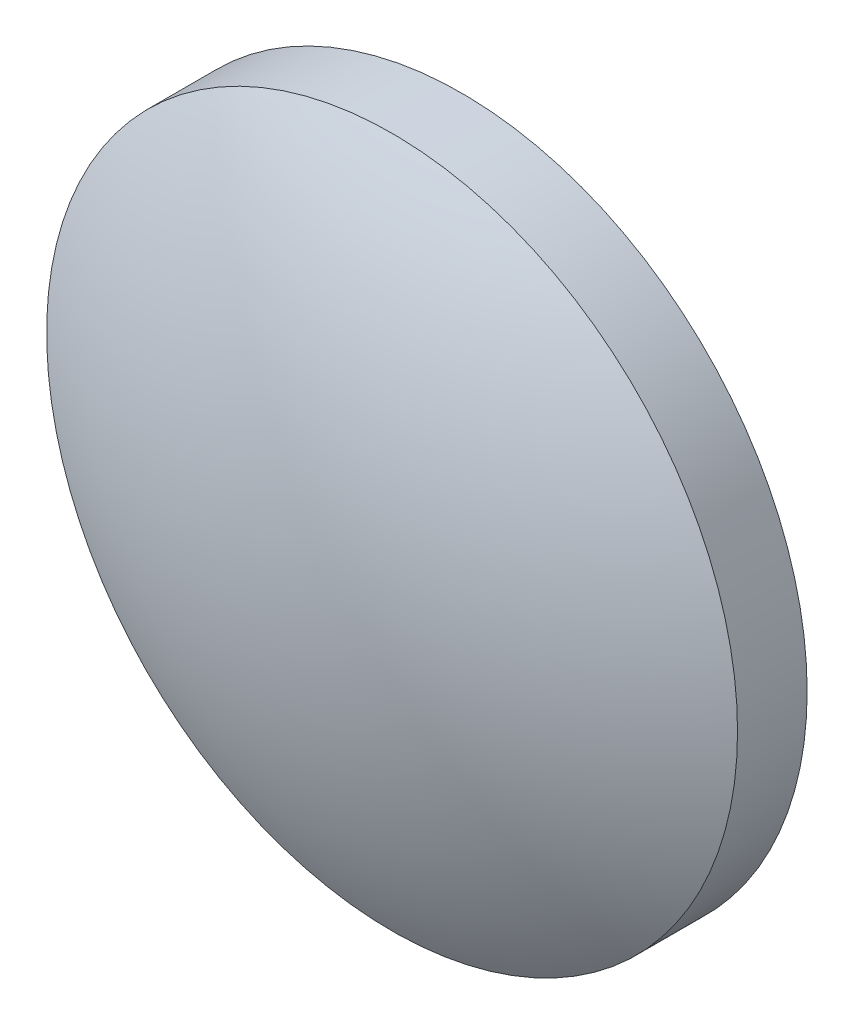
ISO-10303-21;
HEADER;
FILE_DESCRIPTION(('STEP AP214'),'2;1');
FILE_NAME('part.step','',(''),(''),'','','');
FILE_SCHEMA(('AUTOMOTIVE_DESIGN { 1 0 10303 214 1 1 1 1 }'));
ENDSEC;
DATA;
#1=APPLICATION_CONTEXT('core data for automotive mechanical design processes');
#2=APPLICATION_PROTOCOL_DEFINITION('international standard','automotive_design',2000,#1);
#3=PRODUCT_CONTEXT('',#1,'mechanical');
#4=PRODUCT('Part','Part','',(#3));
#5=PRODUCT_RELATED_PRODUCT_CATEGORY('part','',(#4));
#6=PRODUCT_DEFINITION_FORMATION('','',#4);
#7=PRODUCT_DEFINITION_CONTEXT('part definition',#1,'design');
#8=PRODUCT_DEFINITION('design','',#6,#7);
#9=PRODUCT_DEFINITION_SHAPE('','',#8);
#10=(LENGTH_UNIT() NAMED_UNIT(*) SI_UNIT(.MILLI.,.METRE.));
#11=(NAMED_UNIT(*) PLANE_ANGLE_UNIT() SI_UNIT($,.RADIAN.));
#12=(NAMED_UNIT(*) SI_UNIT($,.STERADIAN.) SOLID_ANGLE_UNIT());
#13=UNCERTAINTY_MEASURE_WITH_UNIT(LENGTH_MEASURE(1.E-05),#10,'distance_accuracy_value','');
#14=(GEOMETRIC_REPRESENTATION_CONTEXT(3) GLOBAL_UNCERTAINTY_ASSIGNED_CONTEXT((#13)) GLOBAL_UNIT_ASSIGNED_CONTEXT((#10,
#11,#12)) REPRESENTATION_CONTEXT('',''));
#15=CARTESIAN_POINT('',(0.,0.,0.));
#16=DIRECTION('',(0.,0.,1.));
#17=DIRECTION('',(1.,0.,0.));
#18=AXIS2_PLACEMENT_3D('',#15,#16,#17);
#19=CARTESIAN_POINT('',(0.,0.,4.30813204540037));
#20=DIRECTION('',(0.,0.,1.));
#21=DIRECTION('',(1.,0.,0.));
#22=AXIS2_PLACEMENT_3D('',#19,#20,#21);
#23=CYLINDRICAL_SURFACE('',#22,12.5);
#24=CARTESIAN_POINT('',(0.,0.,-3.33081641154692));
#25=DIRECTION('',(0.,0.,1.));
#26=DIRECTION('',(1.,0.,0.));
#27=AXIS2_PLACEMENT_3D('',#24,#25,#26);
#28=CIRCLE('',#27,12.5);
#29=CARTESIAN_POINT('',(12.5,0.,-3.33081641154692));
#30=VERTEX_POINT('',#29);
#31=EDGE_CURVE('E46',#30,#30,#28,.T.);
#32=ORIENTED_EDGE('',*,*,#31,.F.);
#33=EDGE_LOOP('',(#32));
#34=FACE_BOUND('',#33,.T.);
#35=CARTESIAN_POINT('',(0.,0.,-5.85));
#36=DIRECTION('',(0.,0.,1.));
#37=DIRECTION('',(1.,0.,0.));
#38=AXIS2_PLACEMENT_3D('',#35,#36,#37);
#39=CIRCLE('',#38,12.5);
#40=CARTESIAN_POINT('',(12.5,0.,-5.85));
#41=VERTEX_POINT('',#40);
#42=EDGE_CURVE('E10',#41,#41,#39,.T.);
#43=ORIENTED_EDGE('',*,*,#42,.T.);
#44=EDGE_LOOP('',(#43));
#45=FACE_BOUND('',#44,.T.);
#46=ADVANCED_FACE('F40',(#34,#45),#23,.T.);
#47=CARTESIAN_POINT('',(0.,0.,-5.85));
#48=DIRECTION('',(0.,0.,1.));
#49=DIRECTION('',(1.,0.,0.));
#50=AXIS2_PLACEMENT_3D('',#47,#48,#49);
#51=PLANE('',#50);
#52=ORIENTED_EDGE('',*,*,#42,.F.);
#53=EDGE_LOOP('',(#52));
#54=FACE_BOUND('',#53,.T.);
#55=ADVANCED_FACE('F55',(#54),#51,.F.);
#56=CARTESIAN_POINT('',(0.,0.,-24.9814515061579));
#57=DIRECTION('',(0.,0.,1.));
#58=DIRECTION('',(1.,0.,0.));
#59=AXIS2_PLACEMENT_3D('',#56,#57,#58);
#60=SPHERICAL_SURFACE('',#59,25.);
#61=ORIENTED_EDGE('',*,*,#31,.T.);
#62=EDGE_LOOP('',(#61));
#63=FACE_BOUND('',#62,.T.);
#64=ADVANCED_FACE('F52',(#63),#60,.T.);
#65=CLOSED_SHELL('',(#46,#55,#64));
#66=MANIFOLD_SOLID_BREP('B2',#65);
#67=ADVANCED_BREP_SHAPE_REPRESENTATION('',(#18,#66),#14);
#68=SHAPE_DEFINITION_REPRESENTATION(#9,#67);
ENDSEC;
END-ISO-10303-21;
